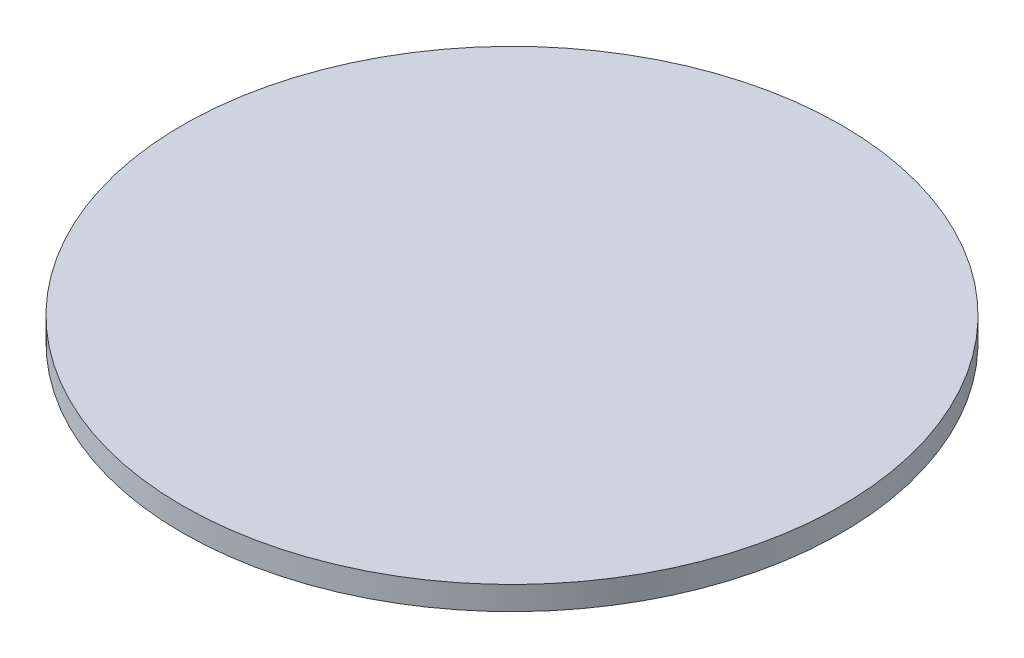
ISO-10303-21;
HEADER;
FILE_DESCRIPTION(('STEP AP214'),'2;1');
FILE_NAME('part.step','',(''),(''),'','','');
FILE_SCHEMA(('AUTOMOTIVE_DESIGN { 1 0 10303 214 1 1 1 1 }'));
ENDSEC;
DATA;
#1=APPLICATION_CONTEXT('core data for automotive mechanical design processes');
#2=APPLICATION_PROTOCOL_DEFINITION('international standard','automotive_design',2000,#1);
#3=PRODUCT_CONTEXT('',#1,'mechanical');
#4=PRODUCT('Part','Part','',(#3));
#5=PRODUCT_RELATED_PRODUCT_CATEGORY('part','',(#4));
#6=PRODUCT_DEFINITION_FORMATION('','',#4);
#7=PRODUCT_DEFINITION_CONTEXT('part definition',#1,'design');
#8=PRODUCT_DEFINITION('design','',#6,#7);
#9=PRODUCT_DEFINITION_SHAPE('','',#8);
#10=(LENGTH_UNIT() NAMED_UNIT(*) SI_UNIT(.MILLI.,.METRE.));
#11=(NAMED_UNIT(*) PLANE_ANGLE_UNIT() SI_UNIT($,.RADIAN.));
#12=(NAMED_UNIT(*) SI_UNIT($,.STERADIAN.) SOLID_ANGLE_UNIT());
#13=UNCERTAINTY_MEASURE_WITH_UNIT(LENGTH_MEASURE(1.E-05),#10,'distance_accuracy_value','');
#14=(GEOMETRIC_REPRESENTATION_CONTEXT(3) GLOBAL_UNCERTAINTY_ASSIGNED_CONTEXT((#13)) GLOBAL_UNIT_ASSIGNED_CONTEXT((#10,
#11,#12)) REPRESENTATION_CONTEXT('',''));
#15=CARTESIAN_POINT('',(0.,0.,0.));
#16=DIRECTION('',(0.,0.,1.));
#17=DIRECTION('',(1.,0.,0.));
#18=AXIS2_PLACEMENT_3D('',#15,#16,#17);
#19=CARTESIAN_POINT('',(0.,6.35,0.));
#20=DIRECTION('',(0.,-1.,0.));
#21=DIRECTION('',(0.,0.,-1.));
#22=AXIS2_PLACEMENT_3D('',#19,#20,#21);
#23=CYLINDRICAL_SURFACE('',#22,88.9);
#24=CARTESIAN_POINT('',(0.,6.35,0.));
#25=DIRECTION('',(0.,1.,0.));
#26=DIRECTION('',(0.,0.,1.));
#27=AXIS2_PLACEMENT_3D('',#24,#25,#26);
#28=CIRCLE('',#27,88.9);
#29=CARTESIAN_POINT('',(0.,6.35,88.9));
#30=VERTEX_POINT('',#29);
#31=EDGE_CURVE('E10',#30,#30,#28,.T.);
#32=ORIENTED_EDGE('',*,*,#31,.F.);
#33=EDGE_LOOP('',(#32));
#34=FACE_BOUND('',#33,.T.);
#35=CARTESIAN_POINT('',(0.,0.,0.));
#36=DIRECTION('',(0.,1.,0.));
#37=DIRECTION('',(0.,0.,1.));
#38=AXIS2_PLACEMENT_3D('',#35,#36,#37);
#39=CIRCLE('',#38,88.9);
#40=CARTESIAN_POINT('',(0.,0.,88.9));
#41=VERTEX_POINT('',#40);
#42=EDGE_CURVE('E40',#41,#41,#39,.T.);
#43=ORIENTED_EDGE('',*,*,#42,.T.);
#44=EDGE_LOOP('',(#43));
#45=FACE_BOUND('',#44,.T.);
#46=ADVANCED_FACE('F37',(#34,#45),#23,.T.);
#47=CARTESIAN_POINT('',(0.,6.35,0.));
#48=DIRECTION('',(0.,1.,0.));
#49=DIRECTION('',(0.,0.,1.));
#50=AXIS2_PLACEMENT_3D('',#47,#48,#49);
#51=PLANE('',#50);
#52=ORIENTED_EDGE('',*,*,#31,.T.);
#53=EDGE_LOOP('',(#52));
#54=FACE_BOUND('',#53,.T.);
#55=ADVANCED_FACE('F54',(#54),#51,.T.);
#56=CARTESIAN_POINT('',(0.,0.,0.));
#57=DIRECTION('',(0.,1.,0.));
#58=DIRECTION('',(0.,0.,1.));
#59=AXIS2_PLACEMENT_3D('',#56,#57,#58);
#60=PLANE('',#59);
#61=ORIENTED_EDGE('',*,*,#42,.F.);
#62=EDGE_LOOP('',(#61));
#63=FACE_BOUND('',#62,.T.);
#64=ADVANCED_FACE('F52',(#63),#60,.F.);
#65=CLOSED_SHELL('',(#46,#55,#64));
#66=MANIFOLD_SOLID_BREP('B2',#65);
#67=ADVANCED_BREP_SHAPE_REPRESENTATION('',(#18,#66),#14);
#68=SHAPE_DEFINITION_REPRESENTATION(#9,#67);
ENDSEC;
END-ISO-10303-21;
